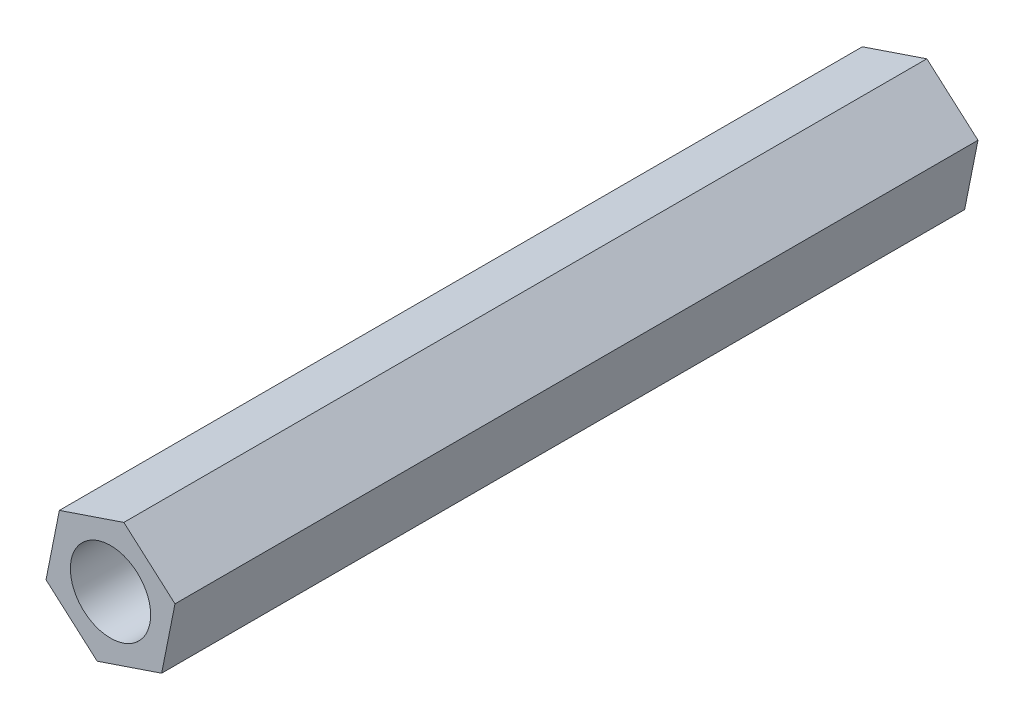
ISO-10303-21;
HEADER;
FILE_DESCRIPTION(('STEP AP214'),'2;1');
FILE_NAME('part.step','',(''),(''),'','','');
FILE_SCHEMA(('AUTOMOTIVE_DESIGN { 1 0 10303 214 1 1 1 1 }'));
ENDSEC;
DATA;
#1=APPLICATION_CONTEXT('core data for automotive mechanical design processes');
#2=APPLICATION_PROTOCOL_DEFINITION('international standard','automotive_design',2000,#1);
#3=PRODUCT_CONTEXT('',#1,'mechanical');
#4=PRODUCT('Part','Part','',(#3));
#5=PRODUCT_RELATED_PRODUCT_CATEGORY('part','',(#4));
#6=PRODUCT_DEFINITION_FORMATION('','',#4);
#7=PRODUCT_DEFINITION_CONTEXT('part definition',#1,'design');
#8=PRODUCT_DEFINITION('design','',#6,#7);
#9=PRODUCT_DEFINITION_SHAPE('','',#8);
#10=(LENGTH_UNIT() NAMED_UNIT(*) SI_UNIT(.MILLI.,.METRE.));
#11=(NAMED_UNIT(*) PLANE_ANGLE_UNIT() SI_UNIT($,.RADIAN.));
#12=(NAMED_UNIT(*) SI_UNIT($,.STERADIAN.) SOLID_ANGLE_UNIT());
#13=UNCERTAINTY_MEASURE_WITH_UNIT(LENGTH_MEASURE(1.E-05),#10,'distance_accuracy_value','');
#14=(GEOMETRIC_REPRESENTATION_CONTEXT(3) GLOBAL_UNCERTAINTY_ASSIGNED_CONTEXT((#13)) GLOBAL_UNIT_ASSIGNED_CONTEXT((#10,
#11,#12)) REPRESENTATION_CONTEXT('',''));
#15=CARTESIAN_POINT('',(0.,0.,0.));
#16=DIRECTION('',(0.,0.,1.));
#17=DIRECTION('',(1.,0.,0.));
#18=AXIS2_PLACEMENT_3D('',#15,#16,#17);
#19=CARTESIAN_POINT('',(0.,0.,32.));
#20=DIRECTION('',(0.,0.,1.));
#21=DIRECTION('',(1.,0.,0.));
#22=AXIS2_PLACEMENT_3D('',#19,#20,#21);
#23=PLANE('',#22);
#24=DIRECTION('',(0.947235538078911,0.320538352464033,0.));
#25=VECTOR('',#24,1.);
#26=CARTESIAN_POINT('',(-0.531918600014743,-2.6609013390751,32.));
#27=LINE('',#26,#25);
#28=CARTESIAN_POINT('',(-0.531918600014743,-2.6609013390751,32.));
#29=VERTEX_POINT('',#28);
#30=CARTESIAN_POINT('',(2.0384488565957,-1.79110568989578,32.));
#31=VERTEX_POINT('',#30);
#32=EDGE_CURVE('E130',#29,#31,#27,.T.);
#33=ORIENTED_EDGE('',*,*,#32,.T.);
#34=DIRECTION('',(0.196023412918392,0.980599215575775,0.));
#35=VECTOR('',#34,1.);
#36=CARTESIAN_POINT('',(2.0384488565957,-1.79110568989578,32.));
#37=LINE('',#36,#35);
#38=CARTESIAN_POINT('',(2.57036745661044,0.869795649179331,32.));
#39=VERTEX_POINT('',#38);
#40=EDGE_CURVE('E88',#31,#39,#37,.T.);
#41=ORIENTED_EDGE('',*,*,#40,.T.);
#42=DIRECTION('',(-0.751212125160518,0.660060863111742,0.));
#43=VECTOR('',#42,1.);
#44=CARTESIAN_POINT('',(2.57036745661044,0.869795649179331,32.));
#45=LINE('',#44,#43);
#46=CARTESIAN_POINT('',(0.531918600014744,2.66090133907511,32.));
#47=VERTEX_POINT('',#46);
#48=EDGE_CURVE('E101',#39,#47,#45,.T.);
#49=ORIENTED_EDGE('',*,*,#48,.T.);
#50=DIRECTION('',(-0.947235538078911,-0.320538352464033,0.));
#51=VECTOR('',#50,1.);
#52=CARTESIAN_POINT('',(0.531918600014744,2.66090133907511,32.));
#53=LINE('',#52,#51);
#54=CARTESIAN_POINT('',(-2.0384488565957,1.79110568989578,32.));
#55=VERTEX_POINT('',#54);
#56=EDGE_CURVE('E95',#47,#55,#53,.T.);
#57=ORIENTED_EDGE('',*,*,#56,.T.);
#58=DIRECTION('',(-0.196023412918393,-0.980599215575775,0.));
#59=VECTOR('',#58,1.);
#60=CARTESIAN_POINT('',(-2.0384488565957,1.79110568989578,32.));
#61=LINE('',#60,#59);
#62=CARTESIAN_POINT('',(-2.57036745661044,-0.869795649179329,32.));
#63=VERTEX_POINT('',#62);
#64=EDGE_CURVE('E99',#55,#63,#61,.T.);
#65=ORIENTED_EDGE('',*,*,#64,.T.);
#66=DIRECTION('',(0.751212125160518,-0.660060863111742,0.));
#67=VECTOR('',#66,1.);
#68=CARTESIAN_POINT('',(-2.57036745661044,-0.869795649179329,32.));
#69=LINE('',#68,#67);
#70=EDGE_CURVE('E51',#63,#29,#69,.T.);
#71=ORIENTED_EDGE('',*,*,#70,.T.);
#72=EDGE_LOOP('',(#33,#41,#49,#57,#65,#71));
#73=FACE_BOUND('',#72,.T.);
#74=CARTESIAN_POINT('',(0.,0.,32.));
#75=DIRECTION('',(0.,0.,1.));
#76=DIRECTION('',(1.,0.,0.));
#77=AXIS2_PLACEMENT_3D('',#74,#75,#76);
#78=CIRCLE('',#77,1.6);
#79=CARTESIAN_POINT('',(1.6,0.,32.));
#80=VERTEX_POINT('',#79);
#81=EDGE_CURVE('E123',#80,#80,#78,.T.);
#82=ORIENTED_EDGE('',*,*,#81,.F.);
#83=EDGE_LOOP('',(#82));
#84=FACE_BOUND('',#83,.T.);
#85=ADVANCED_FACE('F34',(#73,#84),#23,.T.);
#86=CARTESIAN_POINT('',(0.,0.,0.));
#87=DIRECTION('',(0.,0.,1.));
#88=DIRECTION('',(1.,0.,0.));
#89=AXIS2_PLACEMENT_3D('',#86,#87,#88);
#90=PLANE('',#89);
#91=DIRECTION('',(0.947235538078911,0.320538352464033,0.));
#92=VECTOR('',#91,1.);
#93=CARTESIAN_POINT('',(-0.531918600014743,-2.6609013390751,0.));
#94=LINE('',#93,#92);
#95=CARTESIAN_POINT('',(-0.531918600014743,-2.6609013390751,0.));
#96=VERTEX_POINT('',#95);
#97=CARTESIAN_POINT('',(2.0384488565957,-1.79110568989578,0.));
#98=VERTEX_POINT('',#97);
#99=EDGE_CURVE('E119',#96,#98,#94,.T.);
#100=ORIENTED_EDGE('',*,*,#99,.F.);
#101=DIRECTION('',(0.751212125160518,-0.660060863111742,0.));
#102=VECTOR('',#101,1.);
#103=CARTESIAN_POINT('',(-2.57036745661044,-0.869795649179329,0.));
#104=LINE('',#103,#102);
#105=CARTESIAN_POINT('',(-2.57036745661044,-0.869795649179329,0.));
#106=VERTEX_POINT('',#105);
#107=EDGE_CURVE('E80',#106,#96,#104,.T.);
#108=ORIENTED_EDGE('',*,*,#107,.F.);
#109=DIRECTION('',(-0.196023412918393,-0.980599215575775,0.));
#110=VECTOR('',#109,1.);
#111=CARTESIAN_POINT('',(-2.0384488565957,1.79110568989578,0.));
#112=LINE('',#111,#110);
#113=CARTESIAN_POINT('',(-2.0384488565957,1.79110568989578,0.));
#114=VERTEX_POINT('',#113);
#115=EDGE_CURVE('E74',#114,#106,#112,.T.);
#116=ORIENTED_EDGE('',*,*,#115,.F.);
#117=DIRECTION('',(-0.947235538078911,-0.320538352464033,0.));
#118=VECTOR('',#117,1.);
#119=CARTESIAN_POINT('',(0.531918600014744,2.66090133907511,0.));
#120=LINE('',#119,#118);
#121=CARTESIAN_POINT('',(0.531918600014744,2.66090133907511,0.));
#122=VERTEX_POINT('',#121);
#123=EDGE_CURVE('E109',#122,#114,#120,.T.);
#124=ORIENTED_EDGE('',*,*,#123,.F.);
#125=DIRECTION('',(-0.751212125160518,0.660060863111742,0.));
#126=VECTOR('',#125,1.);
#127=CARTESIAN_POINT('',(2.57036745661044,0.869795649179331,0.));
#128=LINE('',#127,#126);
#129=CARTESIAN_POINT('',(2.57036745661044,0.869795649179331,0.));
#130=VERTEX_POINT('',#129);
#131=EDGE_CURVE('E125',#130,#122,#128,.T.);
#132=ORIENTED_EDGE('',*,*,#131,.F.);
#133=DIRECTION('',(0.196023412918392,0.980599215575775,0.));
#134=VECTOR('',#133,1.);
#135=CARTESIAN_POINT('',(2.0384488565957,-1.79110568989578,0.));
#136=LINE('',#135,#134);
#137=EDGE_CURVE('E122',#98,#130,#136,.T.);
#138=ORIENTED_EDGE('',*,*,#137,.F.);
#139=EDGE_LOOP('',(#100,#108,#116,#124,#132,#138));
#140=FACE_BOUND('',#139,.T.);
#141=CARTESIAN_POINT('',(0.,0.,0.));
#142=DIRECTION('',(0.,0.,1.));
#143=DIRECTION('',(1.,0.,0.));
#144=AXIS2_PLACEMENT_3D('',#141,#142,#143);
#145=CIRCLE('',#144,1.6);
#146=CARTESIAN_POINT('',(1.6,0.,0.));
#147=VERTEX_POINT('',#146);
#148=EDGE_CURVE('E223',#147,#147,#145,.T.);
#149=ORIENTED_EDGE('',*,*,#148,.T.);
#150=EDGE_LOOP('',(#149));
#151=FACE_BOUND('',#150,.T.);
#152=ADVANCED_FACE('F139',(#140,#151),#90,.F.);
#153=CARTESIAN_POINT('',(-0.531918600014743,-2.6609013390751,32.));
#154=DIRECTION('',(-0.320538352464033,0.947235538078911,0.));
#155=DIRECTION('',(-0.947235538078911,-0.320538352464033,0.));
#156=AXIS2_PLACEMENT_3D('',#153,#154,#155);
#157=PLANE('',#156);
#158=ORIENTED_EDGE('',*,*,#99,.T.);
#159=DIRECTION('',(0.,0.,-1.));
#160=VECTOR('',#159,1.);
#161=CARTESIAN_POINT('',(2.0384488565957,-1.79110568989578,32.));
#162=LINE('',#161,#160);
#163=EDGE_CURVE('E11',#31,#98,#162,.T.);
#164=ORIENTED_EDGE('',*,*,#163,.F.);
#165=ORIENTED_EDGE('',*,*,#32,.F.);
#166=DIRECTION('',(0.,0.,-1.));
#167=VECTOR('',#166,1.);
#168=CARTESIAN_POINT('',(-0.531918600014743,-2.6609013390751,32.));
#169=LINE('',#168,#167);
#170=EDGE_CURVE('E115',#29,#96,#169,.T.);
#171=ORIENTED_EDGE('',*,*,#170,.T.);
#172=EDGE_LOOP('',(#158,#164,#165,#171));
#173=FACE_BOUND('',#172,.T.);
#174=ADVANCED_FACE('F36',(#173),#157,.F.);
#175=CARTESIAN_POINT('',(2.0384488565957,-1.79110568989578,32.));
#176=DIRECTION('',(-0.980599215575775,0.196023412918392,0.));
#177=DIRECTION('',(-0.196023412918392,-0.980599215575775,0.));
#178=AXIS2_PLACEMENT_3D('',#175,#176,#177);
#179=PLANE('',#178);
#180=ORIENTED_EDGE('',*,*,#137,.T.);
#181=DIRECTION('',(0.,0.,-1.));
#182=VECTOR('',#181,1.);
#183=CARTESIAN_POINT('',(2.57036745661044,0.869795649179331,32.));
#184=LINE('',#183,#182);
#185=EDGE_CURVE('E43',#39,#130,#184,.T.);
#186=ORIENTED_EDGE('',*,*,#185,.F.);
#187=ORIENTED_EDGE('',*,*,#40,.F.);
#188=ORIENTED_EDGE('',*,*,#163,.T.);
#189=EDGE_LOOP('',(#180,#186,#187,#188));
#190=FACE_BOUND('',#189,.T.);
#191=ADVANCED_FACE('F164',(#190),#179,.F.);
#192=CARTESIAN_POINT('',(2.57036745661044,0.869795649179331,32.));
#193=DIRECTION('',(-0.660060863111742,-0.751212125160518,0.));
#194=DIRECTION('',(0.751212125160518,-0.660060863111742,0.));
#195=AXIS2_PLACEMENT_3D('',#192,#193,#194);
#196=PLANE('',#195);
#197=ORIENTED_EDGE('',*,*,#131,.T.);
#198=DIRECTION('',(0.,0.,-1.));
#199=VECTOR('',#198,1.);
#200=CARTESIAN_POINT('',(0.531918600014744,2.66090133907511,32.));
#201=LINE('',#200,#199);
#202=EDGE_CURVE('E110',#47,#122,#201,.T.);
#203=ORIENTED_EDGE('',*,*,#202,.F.);
#204=ORIENTED_EDGE('',*,*,#48,.F.);
#205=ORIENTED_EDGE('',*,*,#185,.T.);
#206=EDGE_LOOP('',(#197,#203,#204,#205));
#207=FACE_BOUND('',#206,.T.);
#208=ADVANCED_FACE('F136',(#207),#196,.F.);
#209=CARTESIAN_POINT('',(0.531918600014744,2.66090133907511,32.));
#210=DIRECTION('',(0.320538352464033,-0.947235538078911,0.));
#211=DIRECTION('',(0.947235538078911,0.320538352464033,0.));
#212=AXIS2_PLACEMENT_3D('',#209,#210,#211);
#213=PLANE('',#212);
#214=ORIENTED_EDGE('',*,*,#123,.T.);
#215=DIRECTION('',(0.,0.,-1.));
#216=VECTOR('',#215,1.);
#217=CARTESIAN_POINT('',(-2.0384488565957,1.79110568989578,32.));
#218=LINE('',#217,#216);
#219=EDGE_CURVE('E106',#55,#114,#218,.T.);
#220=ORIENTED_EDGE('',*,*,#219,.F.);
#221=ORIENTED_EDGE('',*,*,#56,.F.);
#222=ORIENTED_EDGE('',*,*,#202,.T.);
#223=EDGE_LOOP('',(#214,#220,#221,#222));
#224=FACE_BOUND('',#223,.T.);
#225=ADVANCED_FACE('F107',(#224),#213,.F.);
#226=CARTESIAN_POINT('',(-2.0384488565957,1.79110568989578,32.));
#227=DIRECTION('',(0.980599215575775,-0.196023412918393,0.));
#228=DIRECTION('',(0.196023412918393,0.980599215575775,0.));
#229=AXIS2_PLACEMENT_3D('',#226,#227,#228);
#230=PLANE('',#229);
#231=ORIENTED_EDGE('',*,*,#115,.T.);
#232=DIRECTION('',(0.,0.,-1.));
#233=VECTOR('',#232,1.);
#234=CARTESIAN_POINT('',(-2.57036745661044,-0.869795649179329,32.));
#235=LINE('',#234,#233);
#236=EDGE_CURVE('E111',#63,#106,#235,.T.);
#237=ORIENTED_EDGE('',*,*,#236,.F.);
#238=ORIENTED_EDGE('',*,*,#64,.F.);
#239=ORIENTED_EDGE('',*,*,#219,.T.);
#240=EDGE_LOOP('',(#231,#237,#238,#239));
#241=FACE_BOUND('',#240,.T.);
#242=ADVANCED_FACE('F113',(#241),#230,.F.);
#243=CARTESIAN_POINT('',(-2.57036745661044,-0.869795649179329,32.));
#244=DIRECTION('',(0.660060863111742,0.751212125160518,0.));
#245=DIRECTION('',(-0.751212125160518,0.660060863111742,0.));
#246=AXIS2_PLACEMENT_3D('',#243,#244,#245);
#247=PLANE('',#246);
#248=ORIENTED_EDGE('',*,*,#107,.T.);
#249=ORIENTED_EDGE('',*,*,#170,.F.);
#250=ORIENTED_EDGE('',*,*,#70,.F.);
#251=ORIENTED_EDGE('',*,*,#236,.T.);
#252=EDGE_LOOP('',(#248,#249,#250,#251));
#253=FACE_BOUND('',#252,.T.);
#254=ADVANCED_FACE('F144',(#253),#247,.F.);
#255=CARTESIAN_POINT('',(0.,0.,32.));
#256=DIRECTION('',(0.,0.,-1.));
#257=DIRECTION('',(-1.,0.,0.));
#258=AXIS2_PLACEMENT_3D('',#255,#256,#257);
#259=CYLINDRICAL_SURFACE('',#258,1.6);
#260=ORIENTED_EDGE('',*,*,#81,.T.);
#261=EDGE_LOOP('',(#260));
#262=FACE_BOUND('',#261,.T.);
#263=ORIENTED_EDGE('',*,*,#148,.F.);
#264=EDGE_LOOP('',(#263));
#265=FACE_BOUND('',#264,.T.);
#266=ADVANCED_FACE('F146',(#262,#265),#259,.F.);
#267=CLOSED_SHELL('',(#85,#152,#174,#191,#208,#225,#242,#254,#266));
#268=MANIFOLD_SOLID_BREP('B2',#267);
#269=ADVANCED_BREP_SHAPE_REPRESENTATION('',(#18,#268),#14);
#270=SHAPE_DEFINITION_REPRESENTATION(#9,#269);
ENDSEC;
END-ISO-10303-21;
